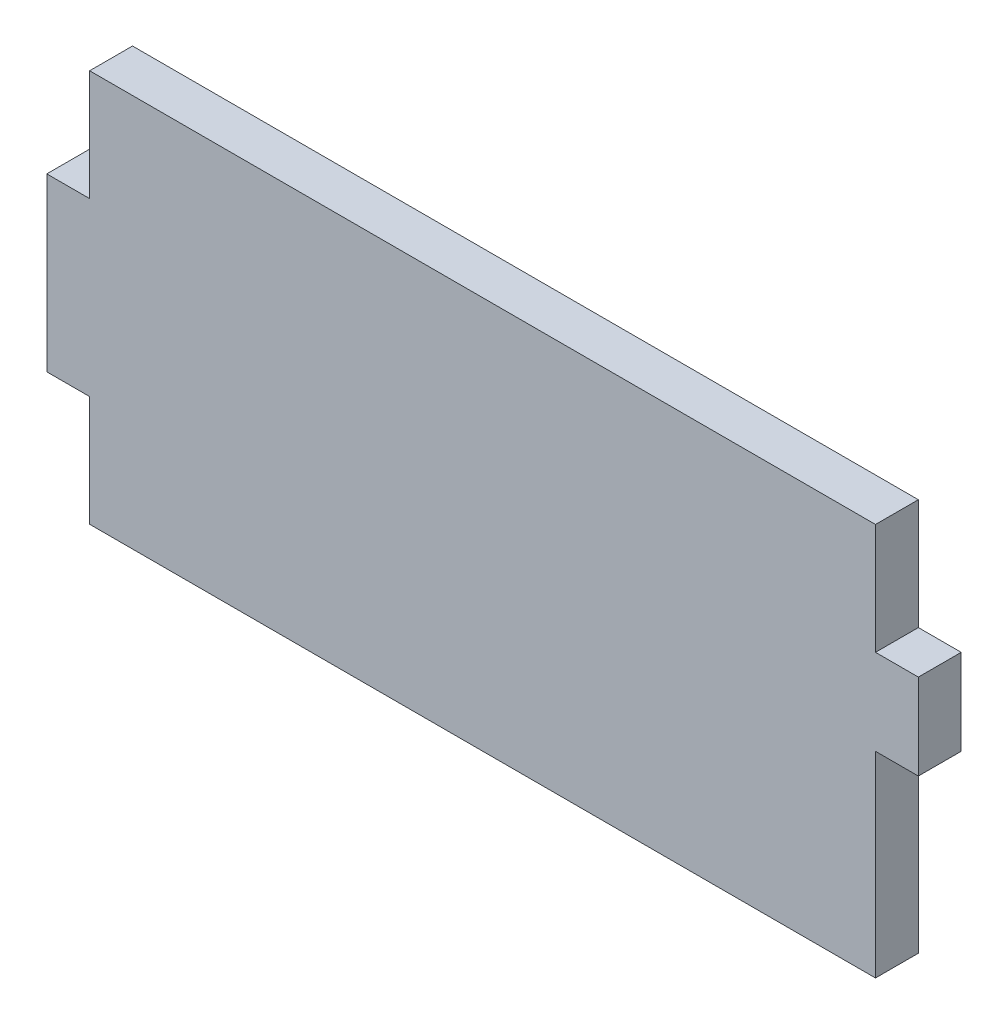
ISO-10303-21;
HEADER;
FILE_DESCRIPTION(('STEP AP214'),'2;1');
FILE_NAME('part.step','',(''),(''),'','','');
FILE_SCHEMA(('AUTOMOTIVE_DESIGN { 1 0 10303 214 1 1 1 1 }'));
ENDSEC;
DATA;
#1=APPLICATION_CONTEXT('core data for automotive mechanical design processes');
#2=APPLICATION_PROTOCOL_DEFINITION('international standard','automotive_design',2000,#1);
#3=PRODUCT_CONTEXT('',#1,'mechanical');
#4=PRODUCT('Part','Part','',(#3));
#5=PRODUCT_RELATED_PRODUCT_CATEGORY('part','',(#4));
#6=PRODUCT_DEFINITION_FORMATION('','',#4);
#7=PRODUCT_DEFINITION_CONTEXT('part definition',#1,'design');
#8=PRODUCT_DEFINITION('design','',#6,#7);
#9=PRODUCT_DEFINITION_SHAPE('','',#8);
#10=(LENGTH_UNIT() NAMED_UNIT(*) SI_UNIT(.MILLI.,.METRE.));
#11=(NAMED_UNIT(*) PLANE_ANGLE_UNIT() SI_UNIT($,.RADIAN.));
#12=(NAMED_UNIT(*) SI_UNIT($,.STERADIAN.) SOLID_ANGLE_UNIT());
#13=UNCERTAINTY_MEASURE_WITH_UNIT(LENGTH_MEASURE(1.E-05),#10,'distance_accuracy_value','');
#14=(GEOMETRIC_REPRESENTATION_CONTEXT(3) GLOBAL_UNCERTAINTY_ASSIGNED_CONTEXT((#13)) GLOBAL_UNIT_ASSIGNED_CONTEXT((#10,
#11,#12)) REPRESENTATION_CONTEXT('',''));
#15=CARTESIAN_POINT('',(0.,0.,0.));
#16=DIRECTION('',(0.,0.,1.));
#17=DIRECTION('',(1.,0.,0.));
#18=AXIS2_PLACEMENT_3D('',#15,#16,#17);
#19=CARTESIAN_POINT('',(0.,0.,3.));
#20=DIRECTION('',(1.,0.,0.));
#21=DIRECTION('',(0.,1.,0.));
#22=AXIS2_PLACEMENT_3D('',#19,#20,#21);
#23=PLANE('',#22);
#24=DIRECTION('',(0.,-1.,0.));
#25=VECTOR('',#24,1.);
#26=CARTESIAN_POINT('',(0.,0.,0.));
#27=LINE('',#26,#25);
#28=CARTESIAN_POINT('',(0.,0.,0.));
#29=VERTEX_POINT('',#28);
#30=CARTESIAN_POINT('',(0.,-7.75,0.));
#31=VERTEX_POINT('',#30);
#32=EDGE_CURVE('E159',#29,#31,#27,.T.);
#33=ORIENTED_EDGE('',*,*,#32,.T.);
#34=DIRECTION('',(0.,0.,-1.));
#35=VECTOR('',#34,1.);
#36=CARTESIAN_POINT('',(0.,-7.75,3.));
#37=LINE('',#36,#35);
#38=CARTESIAN_POINT('',(0.,-7.75,3.));
#39=VERTEX_POINT('',#38);
#40=EDGE_CURVE('E11',#39,#31,#37,.T.);
#41=ORIENTED_EDGE('',*,*,#40,.F.);
#42=DIRECTION('',(0.,-1.,0.));
#43=VECTOR('',#42,1.);
#44=CARTESIAN_POINT('',(0.,0.,3.));
#45=LINE('',#44,#43);
#46=CARTESIAN_POINT('',(0.,0.,3.));
#47=VERTEX_POINT('',#46);
#48=EDGE_CURVE('E181',#47,#39,#45,.T.);
#49=ORIENTED_EDGE('',*,*,#48,.F.);
#50=DIRECTION('',(0.,0.,-1.));
#51=VECTOR('',#50,1.);
#52=CARTESIAN_POINT('',(0.,0.,3.));
#53=LINE('',#52,#51);
#54=EDGE_CURVE('E155',#47,#29,#53,.T.);
#55=ORIENTED_EDGE('',*,*,#54,.T.);
#56=EDGE_LOOP('',(#33,#41,#49,#55));
#57=FACE_BOUND('',#56,.T.);
#58=ADVANCED_FACE('F39',(#57),#23,.F.);
#59=CARTESIAN_POINT('',(0.,-7.75,3.));
#60=DIRECTION('',(0.,-1.,0.));
#61=DIRECTION('',(0.,0.,-1.));
#62=AXIS2_PLACEMENT_3D('',#59,#60,#61);
#63=PLANE('',#62);
#64=DIRECTION('',(-1.,0.,0.));
#65=VECTOR('',#64,1.);
#66=CARTESIAN_POINT('',(0.,-7.75,0.));
#67=LINE('',#66,#65);
#68=CARTESIAN_POINT('',(-3.,-7.75,0.));
#69=VERTEX_POINT('',#68);
#70=EDGE_CURVE('E162',#31,#69,#67,.T.);
#71=ORIENTED_EDGE('',*,*,#70,.T.);
#72=DIRECTION('',(0.,0.,-1.));
#73=VECTOR('',#72,1.);
#74=CARTESIAN_POINT('',(-3.,-7.75,3.));
#75=LINE('',#74,#73);
#76=CARTESIAN_POINT('',(-3.,-7.75,3.));
#77=VERTEX_POINT('',#76);
#78=EDGE_CURVE('E47',#77,#69,#75,.T.);
#79=ORIENTED_EDGE('',*,*,#78,.F.);
#80=DIRECTION('',(-1.,0.,0.));
#81=VECTOR('',#80,1.);
#82=CARTESIAN_POINT('',(0.,-7.75,3.));
#83=LINE('',#82,#81);
#84=EDGE_CURVE('E110',#39,#77,#83,.T.);
#85=ORIENTED_EDGE('',*,*,#84,.F.);
#86=ORIENTED_EDGE('',*,*,#40,.T.);
#87=EDGE_LOOP('',(#71,#79,#85,#86));
#88=FACE_BOUND('',#87,.T.);
#89=ADVANCED_FACE('F259',(#88),#63,.F.);
#90=CARTESIAN_POINT('',(-3.,-7.75,3.));
#91=DIRECTION('',(1.,0.,0.));
#92=DIRECTION('',(0.,1.,0.));
#93=AXIS2_PLACEMENT_3D('',#90,#91,#92);
#94=PLANE('',#93);
#95=DIRECTION('',(0.,-1.,0.));
#96=VECTOR('',#95,1.);
#97=CARTESIAN_POINT('',(-3.,-7.75,0.));
#98=LINE('',#97,#96);
#99=CARTESIAN_POINT('',(-3.,-19.75,0.));
#100=VERTEX_POINT('',#99);
#101=EDGE_CURVE('E164',#69,#100,#98,.T.);
#102=ORIENTED_EDGE('',*,*,#101,.T.);
#103=DIRECTION('',(0.,0.,-1.));
#104=VECTOR('',#103,1.);
#105=CARTESIAN_POINT('',(-3.,-19.75,3.));
#106=LINE('',#105,#104);
#107=CARTESIAN_POINT('',(-3.,-19.75,3.));
#108=VERTEX_POINT('',#107);
#109=EDGE_CURVE('E200',#108,#100,#106,.T.);
#110=ORIENTED_EDGE('',*,*,#109,.F.);
#111=DIRECTION('',(0.,-1.,0.));
#112=VECTOR('',#111,1.);
#113=CARTESIAN_POINT('',(-3.,-7.75,3.));
#114=LINE('',#113,#112);
#115=EDGE_CURVE('E208',#77,#108,#114,.T.);
#116=ORIENTED_EDGE('',*,*,#115,.F.);
#117=ORIENTED_EDGE('',*,*,#78,.T.);
#118=EDGE_LOOP('',(#102,#110,#116,#117));
#119=FACE_BOUND('',#118,.T.);
#120=ADVANCED_FACE('F206',(#119),#94,.F.);
#121=CARTESIAN_POINT('',(0.,-19.75,3.));
#122=DIRECTION('',(0.,1.,0.));
#123=DIRECTION('',(0.,0.,1.));
#124=AXIS2_PLACEMENT_3D('',#121,#122,#123);
#125=PLANE('',#124);
#126=DIRECTION('',(1.,0.,0.));
#127=VECTOR('',#126,1.);
#128=CARTESIAN_POINT('',(0.,-19.75,0.));
#129=LINE('',#128,#127);
#130=CARTESIAN_POINT('',(0.,-19.75,0.));
#131=VERTEX_POINT('',#130);
#132=EDGE_CURVE('E166',#100,#131,#129,.T.);
#133=ORIENTED_EDGE('',*,*,#132,.T.);
#134=DIRECTION('',(0.,0.,-1.));
#135=VECTOR('',#134,1.);
#136=CARTESIAN_POINT('',(0.,-19.75,3.));
#137=LINE('',#136,#135);
#138=CARTESIAN_POINT('',(0.,-19.75,3.));
#139=VERTEX_POINT('',#138);
#140=EDGE_CURVE('E197',#139,#131,#137,.T.);
#141=ORIENTED_EDGE('',*,*,#140,.F.);
#142=DIRECTION('',(1.,0.,0.));
#143=VECTOR('',#142,1.);
#144=CARTESIAN_POINT('',(0.,-19.75,3.));
#145=LINE('',#144,#143);
#146=EDGE_CURVE('E226',#108,#139,#145,.T.);
#147=ORIENTED_EDGE('',*,*,#146,.F.);
#148=ORIENTED_EDGE('',*,*,#109,.T.);
#149=EDGE_LOOP('',(#133,#141,#147,#148));
#150=FACE_BOUND('',#149,.T.);
#151=ADVANCED_FACE('F217',(#150),#125,.F.);
#152=CARTESIAN_POINT('',(0.,-19.75,3.));
#153=DIRECTION('',(1.,0.,0.));
#154=DIRECTION('',(0.,1.,0.));
#155=AXIS2_PLACEMENT_3D('',#152,#153,#154);
#156=PLANE('',#155);
#157=DIRECTION('',(0.,-1.,0.));
#158=VECTOR('',#157,1.);
#159=CARTESIAN_POINT('',(0.,-19.75,0.));
#160=LINE('',#159,#158);
#161=CARTESIAN_POINT('',(0.,-27.49,0.));
#162=VERTEX_POINT('',#161);
#163=EDGE_CURVE('E168',#131,#162,#160,.T.);
#164=ORIENTED_EDGE('',*,*,#163,.T.);
#165=DIRECTION('',(0.,0.,-1.));
#166=VECTOR('',#165,1.);
#167=CARTESIAN_POINT('',(0.,-27.49,3.));
#168=LINE('',#167,#166);
#169=CARTESIAN_POINT('',(0.,-27.49,3.));
#170=VERTEX_POINT('',#169);
#171=EDGE_CURVE('E194',#170,#162,#168,.T.);
#172=ORIENTED_EDGE('',*,*,#171,.F.);
#173=DIRECTION('',(0.,-1.,0.));
#174=VECTOR('',#173,1.);
#175=CARTESIAN_POINT('',(0.,-19.75,3.));
#176=LINE('',#175,#174);
#177=EDGE_CURVE('E223',#139,#170,#176,.T.);
#178=ORIENTED_EDGE('',*,*,#177,.F.);
#179=ORIENTED_EDGE('',*,*,#140,.T.);
#180=EDGE_LOOP('',(#164,#172,#178,#179));
#181=FACE_BOUND('',#180,.T.);
#182=ADVANCED_FACE('F221',(#181),#156,.F.);
#183=CARTESIAN_POINT('',(0.,-27.49,3.));
#184=DIRECTION('',(0.,1.,0.));
#185=DIRECTION('',(-1.,0.,0.));
#186=AXIS2_PLACEMENT_3D('',#183,#184,#185);
#187=PLANE('',#186);
#188=DIRECTION('',(1.,0.,0.));
#189=VECTOR('',#188,1.);
#190=CARTESIAN_POINT('',(0.,-27.49,0.));
#191=LINE('',#190,#189);
#192=CARTESIAN_POINT('',(55.,-27.49,0.));
#193=VERTEX_POINT('',#192);
#194=EDGE_CURVE('E170',#162,#193,#191,.T.);
#195=ORIENTED_EDGE('',*,*,#194,.T.);
#196=DIRECTION('',(0.,0.,-1.));
#197=VECTOR('',#196,1.);
#198=CARTESIAN_POINT('',(55.,-27.49,3.));
#199=LINE('',#198,#197);
#200=CARTESIAN_POINT('',(55.,-27.49,3.));
#201=VERTEX_POINT('',#200);
#202=EDGE_CURVE('E191',#201,#193,#199,.T.);
#203=ORIENTED_EDGE('',*,*,#202,.F.);
#204=DIRECTION('',(1.,0.,0.));
#205=VECTOR('',#204,1.);
#206=CARTESIAN_POINT('',(0.,-27.49,3.));
#207=LINE('',#206,#205);
#208=EDGE_CURVE('E225',#170,#201,#207,.T.);
#209=ORIENTED_EDGE('',*,*,#208,.F.);
#210=ORIENTED_EDGE('',*,*,#171,.T.);
#211=EDGE_LOOP('',(#195,#203,#209,#210));
#212=FACE_BOUND('',#211,.T.);
#213=ADVANCED_FACE('F272',(#212),#187,.F.);
#214=CARTESIAN_POINT('',(55.,-13.75,3.));
#215=DIRECTION('',(-1.,0.,0.));
#216=DIRECTION('',(0.,-1.,0.));
#217=AXIS2_PLACEMENT_3D('',#214,#215,#216);
#218=PLANE('',#217);
#219=DIRECTION('',(0.,1.,0.));
#220=VECTOR('',#219,1.);
#221=CARTESIAN_POINT('',(55.,-13.75,0.));
#222=LINE('',#221,#220);
#223=CARTESIAN_POINT('',(55.,-13.75,0.));
#224=VERTEX_POINT('',#223);
#225=EDGE_CURVE('E172',#193,#224,#222,.T.);
#226=ORIENTED_EDGE('',*,*,#225,.T.);
#227=DIRECTION('',(0.,0.,-1.));
#228=VECTOR('',#227,1.);
#229=CARTESIAN_POINT('',(55.,-13.75,3.));
#230=LINE('',#229,#228);
#231=CARTESIAN_POINT('',(55.,-13.75,3.));
#232=VERTEX_POINT('',#231);
#233=EDGE_CURVE('E188',#232,#224,#230,.T.);
#234=ORIENTED_EDGE('',*,*,#233,.F.);
#235=DIRECTION('',(0.,1.,0.));
#236=VECTOR('',#235,1.);
#237=CARTESIAN_POINT('',(55.,-13.75,3.));
#238=LINE('',#237,#236);
#239=EDGE_CURVE('E228',#201,#232,#238,.T.);
#240=ORIENTED_EDGE('',*,*,#239,.F.);
#241=ORIENTED_EDGE('',*,*,#202,.T.);
#242=EDGE_LOOP('',(#226,#234,#240,#241));
#243=FACE_BOUND('',#242,.T.);
#244=ADVANCED_FACE('F275',(#243),#218,.F.);
#245=CARTESIAN_POINT('',(55.,-13.75,3.));
#246=DIRECTION('',(0.,1.,0.));
#247=DIRECTION('',(0.,0.,1.));
#248=AXIS2_PLACEMENT_3D('',#245,#246,#247);
#249=PLANE('',#248);
#250=DIRECTION('',(1.,0.,0.));
#251=VECTOR('',#250,1.);
#252=CARTESIAN_POINT('',(55.,-13.75,0.));
#253=LINE('',#252,#251);
#254=CARTESIAN_POINT('',(58.,-13.75,0.));
#255=VERTEX_POINT('',#254);
#256=EDGE_CURVE('E174',#224,#255,#253,.T.);
#257=ORIENTED_EDGE('',*,*,#256,.T.);
#258=DIRECTION('',(0.,0.,-1.));
#259=VECTOR('',#258,1.);
#260=CARTESIAN_POINT('',(58.,-13.75,3.));
#261=LINE('',#260,#259);
#262=CARTESIAN_POINT('',(58.,-13.75,3.));
#263=VERTEX_POINT('',#262);
#264=EDGE_CURVE('E185',#263,#255,#261,.T.);
#265=ORIENTED_EDGE('',*,*,#264,.F.);
#266=DIRECTION('',(1.,0.,0.));
#267=VECTOR('',#266,1.);
#268=CARTESIAN_POINT('',(55.,-13.75,3.));
#269=LINE('',#268,#267);
#270=EDGE_CURVE('E234',#232,#263,#269,.T.);
#271=ORIENTED_EDGE('',*,*,#270,.F.);
#272=ORIENTED_EDGE('',*,*,#233,.T.);
#273=EDGE_LOOP('',(#257,#265,#271,#272));
#274=FACE_BOUND('',#273,.T.);
#275=ADVANCED_FACE('F240',(#274),#249,.F.);
#276=CARTESIAN_POINT('',(58.,-7.75,3.));
#277=DIRECTION('',(-1.,0.,0.));
#278=DIRECTION('',(0.,0.,1.));
#279=AXIS2_PLACEMENT_3D('',#276,#277,#278);
#280=PLANE('',#279);
#281=DIRECTION('',(0.,1.,0.));
#282=VECTOR('',#281,1.);
#283=CARTESIAN_POINT('',(58.,-7.75,0.));
#284=LINE('',#283,#282);
#285=CARTESIAN_POINT('',(58.,-7.75,0.));
#286=VERTEX_POINT('',#285);
#287=EDGE_CURVE('E176',#255,#286,#284,.T.);
#288=ORIENTED_EDGE('',*,*,#287,.T.);
#289=DIRECTION('',(0.,0.,-1.));
#290=VECTOR('',#289,1.);
#291=CARTESIAN_POINT('',(58.,-7.75,3.));
#292=LINE('',#291,#290);
#293=CARTESIAN_POINT('',(58.,-7.75,3.));
#294=VERTEX_POINT('',#293);
#295=EDGE_CURVE('E150',#294,#286,#292,.T.);
#296=ORIENTED_EDGE('',*,*,#295,.F.);
#297=DIRECTION('',(0.,1.,0.));
#298=VECTOR('',#297,1.);
#299=CARTESIAN_POINT('',(58.,-7.75,3.));
#300=LINE('',#299,#298);
#301=EDGE_CURVE('E141',#263,#294,#300,.T.);
#302=ORIENTED_EDGE('',*,*,#301,.F.);
#303=ORIENTED_EDGE('',*,*,#264,.T.);
#304=EDGE_LOOP('',(#288,#296,#302,#303));
#305=FACE_BOUND('',#304,.T.);
#306=ADVANCED_FACE('F244',(#305),#280,.F.);
#307=CARTESIAN_POINT('',(55.,-7.75,3.));
#308=DIRECTION('',(0.,-1.,0.));
#309=DIRECTION('',(0.,0.,-1.));
#310=AXIS2_PLACEMENT_3D('',#307,#308,#309);
#311=PLANE('',#310);
#312=DIRECTION('',(-1.,0.,0.));
#313=VECTOR('',#312,1.);
#314=CARTESIAN_POINT('',(55.,-7.75,0.));
#315=LINE('',#314,#313);
#316=CARTESIAN_POINT('',(55.,-7.75,0.));
#317=VERTEX_POINT('',#316);
#318=EDGE_CURVE('E149',#286,#317,#315,.T.);
#319=ORIENTED_EDGE('',*,*,#318,.T.);
#320=DIRECTION('',(0.,0.,-1.));
#321=VECTOR('',#320,1.);
#322=CARTESIAN_POINT('',(55.,-7.75,3.));
#323=LINE('',#322,#321);
#324=CARTESIAN_POINT('',(55.,-7.75,3.));
#325=VERTEX_POINT('',#324);
#326=EDGE_CURVE('E146',#325,#317,#323,.T.);
#327=ORIENTED_EDGE('',*,*,#326,.F.);
#328=DIRECTION('',(-1.,0.,0.));
#329=VECTOR('',#328,1.);
#330=CARTESIAN_POINT('',(55.,-7.75,3.));
#331=LINE('',#330,#329);
#332=EDGE_CURVE('E135',#294,#325,#331,.T.);
#333=ORIENTED_EDGE('',*,*,#332,.F.);
#334=ORIENTED_EDGE('',*,*,#295,.T.);
#335=EDGE_LOOP('',(#319,#327,#333,#334));
#336=FACE_BOUND('',#335,.T.);
#337=ADVANCED_FACE('F147',(#336),#311,.F.);
#338=CARTESIAN_POINT('',(55.,0.,3.));
#339=DIRECTION('',(-1.,0.,0.));
#340=DIRECTION('',(0.,-1.,0.));
#341=AXIS2_PLACEMENT_3D('',#338,#339,#340);
#342=PLANE('',#341);
#343=DIRECTION('',(0.,1.,0.));
#344=VECTOR('',#343,1.);
#345=CARTESIAN_POINT('',(55.,0.,0.));
#346=LINE('',#345,#344);
#347=CARTESIAN_POINT('',(55.,0.,0.));
#348=VERTEX_POINT('',#347);
#349=EDGE_CURVE('E96',#317,#348,#346,.T.);
#350=ORIENTED_EDGE('',*,*,#349,.T.);
#351=DIRECTION('',(0.,0.,-1.));
#352=VECTOR('',#351,1.);
#353=CARTESIAN_POINT('',(55.,0.,3.));
#354=LINE('',#353,#352);
#355=CARTESIAN_POINT('',(55.,0.,3.));
#356=VERTEX_POINT('',#355);
#357=EDGE_CURVE('E151',#356,#348,#354,.T.);
#358=ORIENTED_EDGE('',*,*,#357,.F.);
#359=DIRECTION('',(0.,1.,0.));
#360=VECTOR('',#359,1.);
#361=CARTESIAN_POINT('',(55.,0.,3.));
#362=LINE('',#361,#360);
#363=EDGE_CURVE('E139',#325,#356,#362,.T.);
#364=ORIENTED_EDGE('',*,*,#363,.F.);
#365=ORIENTED_EDGE('',*,*,#326,.T.);
#366=EDGE_LOOP('',(#350,#358,#364,#365));
#367=FACE_BOUND('',#366,.T.);
#368=ADVANCED_FACE('F153',(#367),#342,.F.);
#369=CARTESIAN_POINT('',(0.,0.,3.));
#370=DIRECTION('',(0.,-1.,0.));
#371=DIRECTION('',(0.,0.,-1.));
#372=AXIS2_PLACEMENT_3D('',#369,#370,#371);
#373=PLANE('',#372);
#374=DIRECTION('',(-1.,0.,0.));
#375=VECTOR('',#374,1.);
#376=CARTESIAN_POINT('',(0.,0.,0.));
#377=LINE('',#376,#375);
#378=EDGE_CURVE('E102',#348,#29,#377,.T.);
#379=ORIENTED_EDGE('',*,*,#378,.T.);
#380=ORIENTED_EDGE('',*,*,#54,.F.);
#381=DIRECTION('',(-1.,0.,0.));
#382=VECTOR('',#381,1.);
#383=CARTESIAN_POINT('',(0.,0.,3.));
#384=LINE('',#383,#382);
#385=EDGE_CURVE('E55',#356,#47,#384,.T.);
#386=ORIENTED_EDGE('',*,*,#385,.F.);
#387=ORIENTED_EDGE('',*,*,#357,.T.);
#388=EDGE_LOOP('',(#379,#380,#386,#387));
#389=FACE_BOUND('',#388,.T.);
#390=ADVANCED_FACE('F248',(#389),#373,.F.);
#391=CARTESIAN_POINT('',(0.,0.,3.));
#392=DIRECTION('',(0.,0.,-1.));
#393=DIRECTION('',(-1.,0.,0.));
#394=AXIS2_PLACEMENT_3D('',#391,#392,#393);
#395=PLANE('',#394);
#396=ORIENTED_EDGE('',*,*,#48,.T.);
#397=ORIENTED_EDGE('',*,*,#84,.T.);
#398=ORIENTED_EDGE('',*,*,#115,.T.);
#399=ORIENTED_EDGE('',*,*,#146,.T.);
#400=ORIENTED_EDGE('',*,*,#177,.T.);
#401=ORIENTED_EDGE('',*,*,#208,.T.);
#402=ORIENTED_EDGE('',*,*,#239,.T.);
#403=ORIENTED_EDGE('',*,*,#270,.T.);
#404=ORIENTED_EDGE('',*,*,#301,.T.);
#405=ORIENTED_EDGE('',*,*,#332,.T.);
#406=ORIENTED_EDGE('',*,*,#363,.T.);
#407=ORIENTED_EDGE('',*,*,#385,.T.);
#408=EDGE_LOOP('',(#396,#397,#398,#399,#400,#401,#402,#403,#404,#405,#406,#407));
#409=FACE_BOUND('',#408,.T.);
#410=ADVANCED_FACE('F137',(#409),#395,.F.);
#411=CARTESIAN_POINT('',(0.,0.,0.));
#412=DIRECTION('',(0.,0.,-1.));
#413=DIRECTION('',(-1.,0.,0.));
#414=AXIS2_PLACEMENT_3D('',#411,#412,#413);
#415=PLANE('',#414);
#416=ORIENTED_EDGE('',*,*,#32,.F.);
#417=ORIENTED_EDGE('',*,*,#378,.F.);
#418=ORIENTED_EDGE('',*,*,#349,.F.);
#419=ORIENTED_EDGE('',*,*,#318,.F.);
#420=ORIENTED_EDGE('',*,*,#287,.F.);
#421=ORIENTED_EDGE('',*,*,#256,.F.);
#422=ORIENTED_EDGE('',*,*,#225,.F.);
#423=ORIENTED_EDGE('',*,*,#194,.F.);
#424=ORIENTED_EDGE('',*,*,#163,.F.);
#425=ORIENTED_EDGE('',*,*,#132,.F.);
#426=ORIENTED_EDGE('',*,*,#101,.F.);
#427=ORIENTED_EDGE('',*,*,#70,.F.);
#428=EDGE_LOOP('',(#416,#417,#418,#419,#420,#421,#422,#423,#424,#425,#426,#427));
#429=FACE_BOUND('',#428,.T.);
#430=ADVANCED_FACE('F212',(#429),#415,.T.);
#431=CLOSED_SHELL('',(#58,#89,#120,#151,#182,#213,#244,#275,#306,#337,#368,#390,#410,#430));
#432=MANIFOLD_SOLID_BREP('B2',#431);
#433=ADVANCED_BREP_SHAPE_REPRESENTATION('',(#18,#432),#14);
#434=SHAPE_DEFINITION_REPRESENTATION(#9,#433);
ENDSEC;
END-ISO-10303-21;
